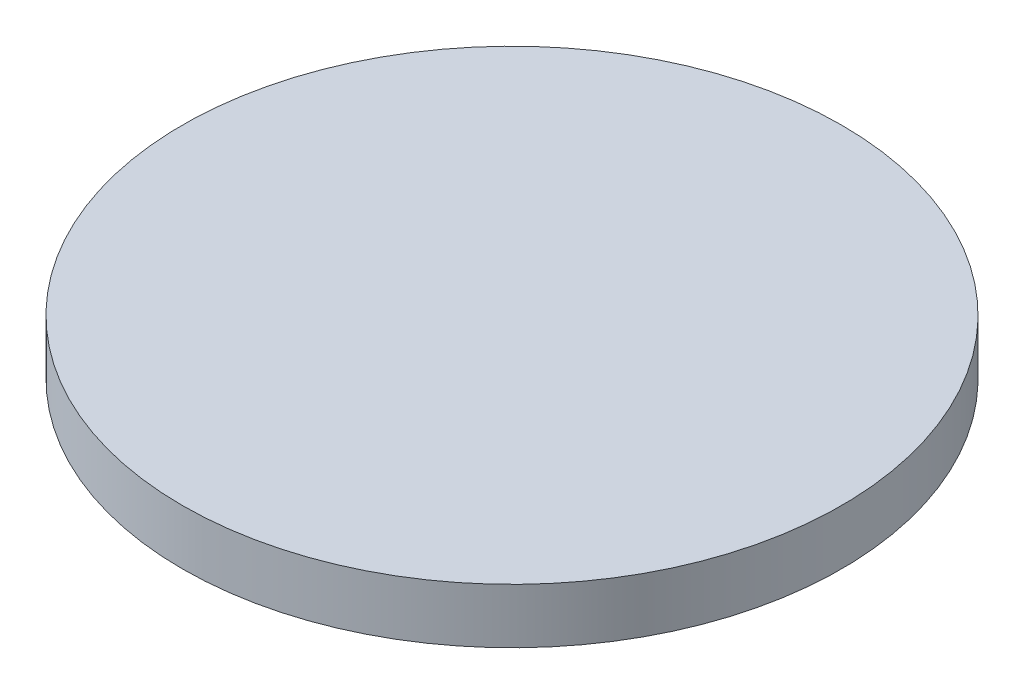
ISO-10303-21;
HEADER;
FILE_DESCRIPTION(('STEP AP214'),'2;1');
FILE_NAME('part.step','',(''),(''),'','','');
FILE_SCHEMA(('AUTOMOTIVE_DESIGN { 1 0 10303 214 1 1 1 1 }'));
ENDSEC;
DATA;
#1=APPLICATION_CONTEXT('core data for automotive mechanical design processes');
#2=APPLICATION_PROTOCOL_DEFINITION('international standard','automotive_design',2000,#1);
#3=PRODUCT_CONTEXT('',#1,'mechanical');
#4=PRODUCT('Part','Part','',(#3));
#5=PRODUCT_RELATED_PRODUCT_CATEGORY('part','',(#4));
#6=PRODUCT_DEFINITION_FORMATION('','',#4);
#7=PRODUCT_DEFINITION_CONTEXT('part definition',#1,'design');
#8=PRODUCT_DEFINITION('design','',#6,#7);
#9=PRODUCT_DEFINITION_SHAPE('','',#8);
#10=(LENGTH_UNIT() NAMED_UNIT(*) SI_UNIT(.MILLI.,.METRE.));
#11=(NAMED_UNIT(*) PLANE_ANGLE_UNIT() SI_UNIT($,.RADIAN.));
#12=(NAMED_UNIT(*) SI_UNIT($,.STERADIAN.) SOLID_ANGLE_UNIT());
#13=UNCERTAINTY_MEASURE_WITH_UNIT(LENGTH_MEASURE(1.E-05),#10,'distance_accuracy_value','');
#14=(GEOMETRIC_REPRESENTATION_CONTEXT(3) GLOBAL_UNCERTAINTY_ASSIGNED_CONTEXT((#13)) GLOBAL_UNIT_ASSIGNED_CONTEXT((#10,
#11,#12)) REPRESENTATION_CONTEXT('',''));
#15=CARTESIAN_POINT('',(0.,0.,0.));
#16=DIRECTION('',(0.,0.,1.));
#17=DIRECTION('',(1.,0.,0.));
#18=AXIS2_PLACEMENT_3D('',#15,#16,#17);
#19=CARTESIAN_POINT('',(-24.,0.,0.));
#20=DIRECTION('',(0.,1.,0.));
#21=DIRECTION('',(0.,0.,1.));
#22=AXIS2_PLACEMENT_3D('',#19,#20,#21);
#23=PLANE('',#22);
#24=CARTESIAN_POINT('',(0.,0.,0.));
#25=DIRECTION('',(0.,-1.,0.));
#26=DIRECTION('',(0.,0.,-1.));
#27=AXIS2_PLACEMENT_3D('',#24,#25,#26);
#28=CIRCLE('',#27,24.);
#29=CARTESIAN_POINT('',(0.,0.,-24.));
#30=VERTEX_POINT('',#29);
#31=EDGE_CURVE('E50',#30,#30,#28,.T.);
#32=ORIENTED_EDGE('',*,*,#31,.T.);
#33=EDGE_LOOP('',(#32));
#34=FACE_BOUND('',#33,.T.);
#35=ADVANCED_FACE('F43',(#34),#23,.F.);
#36=CARTESIAN_POINT('',(0.,4.,0.));
#37=DIRECTION('',(0.,-1.,0.));
#38=DIRECTION('',(0.,0.,-1.));
#39=AXIS2_PLACEMENT_3D('',#36,#37,#38);
#40=PLANE('',#39);
#41=CARTESIAN_POINT('',(0.,4.,0.));
#42=DIRECTION('',(0.,-1.,0.));
#43=DIRECTION('',(0.,0.,-1.));
#44=AXIS2_PLACEMENT_3D('',#41,#42,#43);
#45=CIRCLE('',#44,24.);
#46=CARTESIAN_POINT('',(0.,4.,-24.));
#47=VERTEX_POINT('',#46);
#48=EDGE_CURVE('E10',#47,#47,#45,.T.);
#49=ORIENTED_EDGE('',*,*,#48,.F.);
#50=EDGE_LOOP('',(#49));
#51=FACE_BOUND('',#50,.T.);
#52=ADVANCED_FACE('F60',(#51),#40,.F.);
#53=CARTESIAN_POINT('',(0.,0.,0.));
#54=DIRECTION('',(0.,-1.,0.));
#55=DIRECTION('',(0.,0.,-1.));
#56=AXIS2_PLACEMENT_3D('',#53,#54,#55);
#57=CYLINDRICAL_SURFACE('',#56,24.);
#58=ORIENTED_EDGE('',*,*,#31,.F.);
#59=EDGE_LOOP('',(#58));
#60=FACE_BOUND('',#59,.T.);
#61=ORIENTED_EDGE('',*,*,#48,.T.);
#62=EDGE_LOOP('',(#61));
#63=FACE_BOUND('',#62,.T.);
#64=ADVANCED_FACE('F58',(#60,#63),#57,.T.);
#65=CLOSED_SHELL('',(#35,#52,#64));
#66=MANIFOLD_SOLID_BREP('B2',#65);
#67=ADVANCED_BREP_SHAPE_REPRESENTATION('',(#18,#66),#14);
#68=SHAPE_DEFINITION_REPRESENTATION(#9,#67);
ENDSEC;
END-ISO-10303-21;
